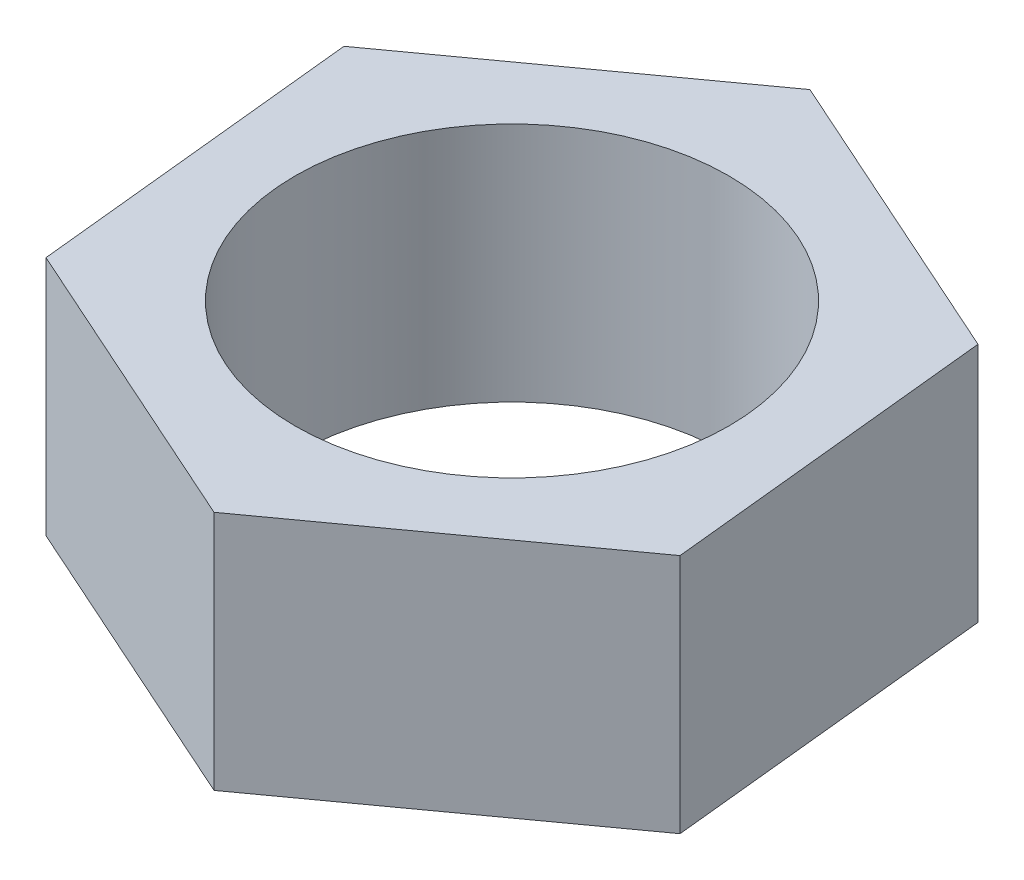
ISO-10303-21;
HEADER;
FILE_DESCRIPTION(('STEP AP214'),'2;1');
FILE_NAME('part.step','',(''),(''),'','','');
FILE_SCHEMA(('AUTOMOTIVE_DESIGN { 1 0 10303 214 1 1 1 1 }'));
ENDSEC;
DATA;
#1=APPLICATION_CONTEXT('core data for automotive mechanical design processes');
#2=APPLICATION_PROTOCOL_DEFINITION('international standard','automotive_design',2000,#1);
#3=PRODUCT_CONTEXT('',#1,'mechanical');
#4=PRODUCT('Part','Part','',(#3));
#5=PRODUCT_RELATED_PRODUCT_CATEGORY('part','',(#4));
#6=PRODUCT_DEFINITION_FORMATION('','',#4);
#7=PRODUCT_DEFINITION_CONTEXT('part definition',#1,'design');
#8=PRODUCT_DEFINITION('design','',#6,#7);
#9=PRODUCT_DEFINITION_SHAPE('','',#8);
#10=(LENGTH_UNIT() NAMED_UNIT(*) SI_UNIT(.MILLI.,.METRE.));
#11=(NAMED_UNIT(*) PLANE_ANGLE_UNIT() SI_UNIT($,.RADIAN.));
#12=(NAMED_UNIT(*) SI_UNIT($,.STERADIAN.) SOLID_ANGLE_UNIT());
#13=UNCERTAINTY_MEASURE_WITH_UNIT(LENGTH_MEASURE(1.E-05),#10,'distance_accuracy_value','');
#14=(GEOMETRIC_REPRESENTATION_CONTEXT(3) GLOBAL_UNCERTAINTY_ASSIGNED_CONTEXT((#13)) GLOBAL_UNIT_ASSIGNED_CONTEXT((#10,
#11,#12)) REPRESENTATION_CONTEXT('',''));
#15=CARTESIAN_POINT('',(0.,0.,0.));
#16=DIRECTION('',(0.,0.,1.));
#17=DIRECTION('',(1.,0.,0.));
#18=AXIS2_PLACEMENT_3D('',#15,#16,#17);
#19=CARTESIAN_POINT('',(4.44089209850063E-13,9.99999999999999,4.44089209850063E-13));
#20=DIRECTION('',(0.,1.,0.));
#21=DIRECTION('',(0.,0.,0.999999999999998));
#22=AXIS2_PLACEMENT_3D('',#19,#20,#21);
#23=PLANE('',#22);
#24=DIRECTION('',(-0.102025444014473,0.,-0.994781789526548));
#25=VECTOR('',#24,1.);
#26=CARTESIAN_POINT('',(12.6442344851103,10.0000000000001,5.66774507944356));
#27=LINE('',#26,#25);
#28=CARTESIAN_POINT('',(12.6442344851103,10.0000000000001,5.66774507944356));
#29=VERTEX_POINT('',#28);
#30=CARTESIAN_POINT('',(11.2305284635279,9.99999999999998,-8.11635573579017));
#31=VERTEX_POINT('',#30);
#32=EDGE_CURVE('E140',#29,#31,#27,.T.);
#33=ORIENTED_EDGE('',*,*,#32,.T.);
#34=DIRECTION('',(-0.912519022959378,0.,-0.409034268414354));
#35=VECTOR('',#34,1.);
#36=CARTESIAN_POINT('',(11.2305284635279,9.99999999999998,-8.11635573579017));
#37=LINE('',#36,#35);
#38=CARTESIAN_POINT('',(-1.41370602158197,9.99999999999998,-13.7841008152335));
#39=VERTEX_POINT('',#38);
#40=EDGE_CURVE('E98',#31,#39,#37,.T.);
#41=ORIENTED_EDGE('',*,*,#40,.T.);
#42=DIRECTION('',(-0.810493578944904,0.,0.585747521112195));
#43=VECTOR('',#42,1.);
#44=CARTESIAN_POINT('',(-1.41370602158197,9.99999999999998,-13.7841008152335));
#45=LINE('',#44,#43);
#46=CARTESIAN_POINT('',(-12.6442344851097,9.99999999999999,-5.66774507944312));
#47=VERTEX_POINT('',#46);
#48=EDGE_CURVE('E111',#39,#47,#45,.T.);
#49=ORIENTED_EDGE('',*,*,#48,.T.);
#50=DIRECTION('',(0.102025444014473,0.,0.994781789526548));
#51=VECTOR('',#50,1.);
#52=CARTESIAN_POINT('',(-12.6442344851097,9.99999999999999,-5.66774507944312));
#53=LINE('',#52,#51);
#54=CARTESIAN_POINT('',(-11.2305284635275,9.99999999999999,8.11635573579195));
#55=VERTEX_POINT('',#54);
#56=EDGE_CURVE('E105',#47,#55,#53,.T.);
#57=ORIENTED_EDGE('',*,*,#56,.T.);
#58=DIRECTION('',(0.912519022959378,0.,0.409034268414354));
#59=VECTOR('',#58,1.);
#60=CARTESIAN_POINT('',(-11.2305284635275,9.99999999999999,8.11635573579195));
#61=LINE('',#60,#59);
#62=CARTESIAN_POINT('',(1.41370602158331,10.0000000000002,13.7841008152346));
#63=VERTEX_POINT('',#62);
#64=EDGE_CURVE('E109',#55,#63,#61,.T.);
#65=ORIENTED_EDGE('',*,*,#64,.T.);
#66=DIRECTION('',(0.810493578944904,0.,-0.585747521112195));
#67=VECTOR('',#66,1.);
#68=CARTESIAN_POINT('',(1.41370602158331,10.0000000000002,13.7841008152346));
#69=LINE('',#68,#67);
#70=EDGE_CURVE('E61',#63,#29,#69,.T.);
#71=ORIENTED_EDGE('',*,*,#70,.T.);
#72=EDGE_LOOP('',(#33,#41,#49,#57,#65,#71));
#73=FACE_BOUND('',#72,.T.);
#74=CARTESIAN_POINT('',(4.44089209850063E-13,9.99999999999999,4.44089209850063E-13));
#75=DIRECTION('',(0.,1.,0.));
#76=DIRECTION('',(0.,0.,0.999999999999998));
#77=AXIS2_PLACEMENT_3D('',#74,#75,#76);
#78=CIRCLE('',#77,9.);
#79=CARTESIAN_POINT('',(4.41591208044657E-13,9.99999999999999,9.00000000000043));
#80=VERTEX_POINT('',#79);
#81=EDGE_CURVE('E133',#80,#80,#78,.T.);
#82=ORIENTED_EDGE('',*,*,#81,.F.);
#83=EDGE_LOOP('',(#82));
#84=FACE_BOUND('',#83,.T.);
#85=ADVANCED_FACE('F44',(#73,#84),#23,.T.);
#86=CARTESIAN_POINT('',(0.,0.,0.));
#87=DIRECTION('',(0.,1.,0.));
#88=DIRECTION('',(0.,0.,0.999999999999998));
#89=AXIS2_PLACEMENT_3D('',#86,#87,#88);
#90=PLANE('',#89);
#91=DIRECTION('',(-0.102025444014473,0.,-0.994781789526548));
#92=VECTOR('',#91,1.);
#93=CARTESIAN_POINT('',(12.6442344851099,1.52655665885959E-13,5.66774507944379));
#94=LINE('',#93,#92);
#95=CARTESIAN_POINT('',(12.6442344851099,1.52655665885959E-13,5.66774507944379));
#96=VERTEX_POINT('',#95);
#97=CARTESIAN_POINT('',(11.2305284635272,0.,-8.11635573578995));
#98=VERTEX_POINT('',#97);
#99=EDGE_CURVE('E129',#96,#98,#94,.T.);
#100=ORIENTED_EDGE('',*,*,#99,.F.);
#101=DIRECTION('',(0.810493578944904,0.,-0.585747521112195));
#102=VECTOR('',#101,1.);
#103=CARTESIAN_POINT('',(1.41370602158242,1.52655665885959E-13,13.7841008152348));
#104=LINE('',#103,#102);
#105=CARTESIAN_POINT('',(1.41370602158242,1.52655665885959E-13,13.7841008152348));
#106=VERTEX_POINT('',#105);
#107=EDGE_CURVE('E90',#106,#96,#104,.T.);
#108=ORIENTED_EDGE('',*,*,#107,.F.);
#109=DIRECTION('',(0.912519022959378,0.,0.409034268414354));
#110=VECTOR('',#109,1.);
#111=CARTESIAN_POINT('',(-11.230528463527,0.,8.11635573579172));
#112=LINE('',#111,#110);
#113=CARTESIAN_POINT('',(-11.230528463527,0.,8.11635573579172));
#114=VERTEX_POINT('',#113);
#115=EDGE_CURVE('E84',#114,#106,#112,.T.);
#116=ORIENTED_EDGE('',*,*,#115,.F.);
#117=DIRECTION('',(0.102025444014473,0.,0.994781789526548));
#118=VECTOR('',#117,1.);
#119=CARTESIAN_POINT('',(-12.6442344851099,0.,-5.66774507944268));
#120=LINE('',#119,#118);
#121=CARTESIAN_POINT('',(-12.6442344851099,0.,-5.66774507944268));
#122=VERTEX_POINT('',#121);
#123=EDGE_CURVE('E119',#122,#114,#120,.T.);
#124=ORIENTED_EDGE('',*,*,#123,.F.);
#125=DIRECTION('',(-0.810493578944904,0.,0.585747521112195));
#126=VECTOR('',#125,1.);
#127=CARTESIAN_POINT('',(-1.41370602158286,0.,-13.7841008152328));
#128=LINE('',#127,#126);
#129=CARTESIAN_POINT('',(-1.41370602158286,0.,-13.7841008152328));
#130=VERTEX_POINT('',#129);
#131=EDGE_CURVE('E135',#130,#122,#128,.T.);
#132=ORIENTED_EDGE('',*,*,#131,.F.);
#133=DIRECTION('',(-0.912519022959378,0.,-0.409034268414354));
#134=VECTOR('',#133,1.);
#135=CARTESIAN_POINT('',(11.2305284635272,0.,-8.11635573578995));
#136=LINE('',#135,#134);
#137=EDGE_CURVE('E132',#98,#130,#136,.T.);
#138=ORIENTED_EDGE('',*,*,#137,.F.);
#139=EDGE_LOOP('',(#100,#108,#116,#124,#132,#138));
#140=FACE_BOUND('',#139,.T.);
#141=CARTESIAN_POINT('',(0.,0.,0.));
#142=DIRECTION('',(0.,1.,0.));
#143=DIRECTION('',(0.,0.,0.999999999999998));
#144=AXIS2_PLACEMENT_3D('',#141,#142,#143);
#145=CIRCLE('',#144,9.);
#146=CARTESIAN_POINT('',(0.,0.,8.99999999999999));
#147=VERTEX_POINT('',#146);
#148=EDGE_CURVE('E215',#147,#147,#145,.T.);
#149=ORIENTED_EDGE('',*,*,#148,.T.);
#150=EDGE_LOOP('',(#149));
#151=FACE_BOUND('',#150,.T.);
#152=ADVANCED_FACE('F149',(#140,#151),#90,.F.);
#153=CARTESIAN_POINT('',(12.6442344851103,10.0000000000001,5.66774507944356));
#154=DIRECTION('',(-0.994781789526556,0.,0.102025444014473));
#155=DIRECTION('',(0.102025444014473,0.,0.994781789526548));
#156=AXIS2_PLACEMENT_3D('',#153,#154,#155);
#157=PLANE('',#156);
#158=ORIENTED_EDGE('',*,*,#99,.T.);
#159=DIRECTION('',(0.,-1.,0.));
#160=VECTOR('',#159,1.);
#161=CARTESIAN_POINT('',(11.2305284635279,9.99999999999998,-8.11635573579017));
#162=LINE('',#161,#160);
#163=EDGE_CURVE('E13',#31,#98,#162,.T.);
#164=ORIENTED_EDGE('',*,*,#163,.F.);
#165=ORIENTED_EDGE('',*,*,#32,.F.);
#166=DIRECTION('',(0.,-1.,0.));
#167=VECTOR('',#166,1.);
#168=CARTESIAN_POINT('',(12.6442344851103,10.0000000000001,5.66774507944356));
#169=LINE('',#168,#167);
#170=EDGE_CURVE('E125',#29,#96,#169,.T.);
#171=ORIENTED_EDGE('',*,*,#170,.T.);
#172=EDGE_LOOP('',(#158,#164,#165,#171));
#173=FACE_BOUND('',#172,.T.);
#174=ADVANCED_FACE('F46',(#173),#157,.F.);
#175=CARTESIAN_POINT('',(11.2305284635279,9.99999999999998,-8.11635573579017));
#176=DIRECTION('',(-0.409034268414357,0.,0.912519022959373));
#177=DIRECTION('',(0.912519022959378,0.,0.409034268414354));
#178=AXIS2_PLACEMENT_3D('',#175,#176,#177);
#179=PLANE('',#178);
#180=ORIENTED_EDGE('',*,*,#137,.T.);
#181=DIRECTION('',(0.,-1.,0.));
#182=VECTOR('',#181,1.);
#183=CARTESIAN_POINT('',(-1.41370602158197,9.99999999999998,-13.7841008152335));
#184=LINE('',#183,#182);
#185=EDGE_CURVE('E53',#39,#130,#184,.T.);
#186=ORIENTED_EDGE('',*,*,#185,.F.);
#187=ORIENTED_EDGE('',*,*,#40,.F.);
#188=ORIENTED_EDGE('',*,*,#163,.T.);
#189=EDGE_LOOP('',(#180,#186,#187,#188));
#190=FACE_BOUND('',#189,.T.);
#191=ADVANCED_FACE('F174',(#190),#179,.F.);
#192=CARTESIAN_POINT('',(-1.41370602158197,9.99999999999998,-13.7841008152335));
#193=DIRECTION('',(0.585747521112199,0.,0.8104935789449));
#194=DIRECTION('',(0.810493578944904,0.,-0.585747521112195));
#195=AXIS2_PLACEMENT_3D('',#192,#193,#194);
#196=PLANE('',#195);
#197=ORIENTED_EDGE('',*,*,#131,.T.);
#198=DIRECTION('',(0.,-1.,0.));
#199=VECTOR('',#198,1.);
#200=CARTESIAN_POINT('',(-12.6442344851097,9.99999999999999,-5.66774507944312));
#201=LINE('',#200,#199);
#202=EDGE_CURVE('E120',#47,#122,#201,.T.);
#203=ORIENTED_EDGE('',*,*,#202,.F.);
#204=ORIENTED_EDGE('',*,*,#48,.F.);
#205=ORIENTED_EDGE('',*,*,#185,.T.);
#206=EDGE_LOOP('',(#197,#203,#204,#205));
#207=FACE_BOUND('',#206,.T.);
#208=ADVANCED_FACE('F146',(#207),#196,.F.);
#209=CARTESIAN_POINT('',(-12.6442344851097,9.99999999999999,-5.66774507944312));
#210=DIRECTION('',(0.994781789526556,0.,-0.102025444014473));
#211=DIRECTION('',(-0.102025444014473,0.,-0.994781789526548));
#212=AXIS2_PLACEMENT_3D('',#209,#210,#211);
#213=PLANE('',#212);
#214=ORIENTED_EDGE('',*,*,#123,.T.);
#215=DIRECTION('',(0.,-1.,0.));
#216=VECTOR('',#215,1.);
#217=CARTESIAN_POINT('',(-11.2305284635275,9.99999999999999,8.11635573579195));
#218=LINE('',#217,#216);
#219=EDGE_CURVE('E116',#55,#114,#218,.T.);
#220=ORIENTED_EDGE('',*,*,#219,.F.);
#221=ORIENTED_EDGE('',*,*,#56,.F.);
#222=ORIENTED_EDGE('',*,*,#202,.T.);
#223=EDGE_LOOP('',(#214,#220,#221,#222));
#224=FACE_BOUND('',#223,.T.);
#225=ADVANCED_FACE('F117',(#224),#213,.F.);
#226=CARTESIAN_POINT('',(-11.2305284635275,9.99999999999999,8.11635573579195));
#227=DIRECTION('',(0.409034268414357,0.,-0.912519022959373));
#228=DIRECTION('',(-0.912519022959378,0.,-0.409034268414354));
#229=AXIS2_PLACEMENT_3D('',#226,#227,#228);
#230=PLANE('',#229);
#231=ORIENTED_EDGE('',*,*,#115,.T.);
#232=DIRECTION('',(0.,-1.,0.));
#233=VECTOR('',#232,1.);
#234=CARTESIAN_POINT('',(1.41370602158331,10.0000000000002,13.7841008152346));
#235=LINE('',#234,#233);
#236=EDGE_CURVE('E121',#63,#106,#235,.T.);
#237=ORIENTED_EDGE('',*,*,#236,.F.);
#238=ORIENTED_EDGE('',*,*,#64,.F.);
#239=ORIENTED_EDGE('',*,*,#219,.T.);
#240=EDGE_LOOP('',(#231,#237,#238,#239));
#241=FACE_BOUND('',#240,.T.);
#242=ADVANCED_FACE('F123',(#241),#230,.F.);
#243=CARTESIAN_POINT('',(1.41370602158331,10.0000000000002,13.7841008152346));
#244=DIRECTION('',(-0.585747521112199,0.,-0.8104935789449));
#245=DIRECTION('',(-0.810493578944904,0.,0.585747521112195));
#246=AXIS2_PLACEMENT_3D('',#243,#244,#245);
#247=PLANE('',#246);
#248=ORIENTED_EDGE('',*,*,#107,.T.);
#249=ORIENTED_EDGE('',*,*,#170,.F.);
#250=ORIENTED_EDGE('',*,*,#70,.F.);
#251=ORIENTED_EDGE('',*,*,#236,.T.);
#252=EDGE_LOOP('',(#248,#249,#250,#251));
#253=FACE_BOUND('',#252,.T.);
#254=ADVANCED_FACE('F154',(#253),#247,.F.);
#255=CARTESIAN_POINT('',(4.44089209850063E-13,9.99999999999999,4.44089209850063E-13));
#256=DIRECTION('',(0.,-1.,0.));
#257=DIRECTION('',(0.,0.,-0.999999999999998));
#258=AXIS2_PLACEMENT_3D('',#255,#256,#257);
#259=CYLINDRICAL_SURFACE('',#258,9.);
#260=ORIENTED_EDGE('',*,*,#81,.T.);
#261=EDGE_LOOP('',(#260));
#262=FACE_BOUND('',#261,.T.);
#263=ORIENTED_EDGE('',*,*,#148,.F.);
#264=EDGE_LOOP('',(#263));
#265=FACE_BOUND('',#264,.T.);
#266=ADVANCED_FACE('F156',(#262,#265),#259,.F.);
#267=CLOSED_SHELL('',(#85,#152,#174,#191,#208,#225,#242,#254,#266));
#268=MANIFOLD_SOLID_BREP('B2',#267);
#269=ADVANCED_BREP_SHAPE_REPRESENTATION('',(#18,#268),#14);
#270=SHAPE_DEFINITION_REPRESENTATION(#9,#269);
ENDSEC;
END-ISO-10303-21;
